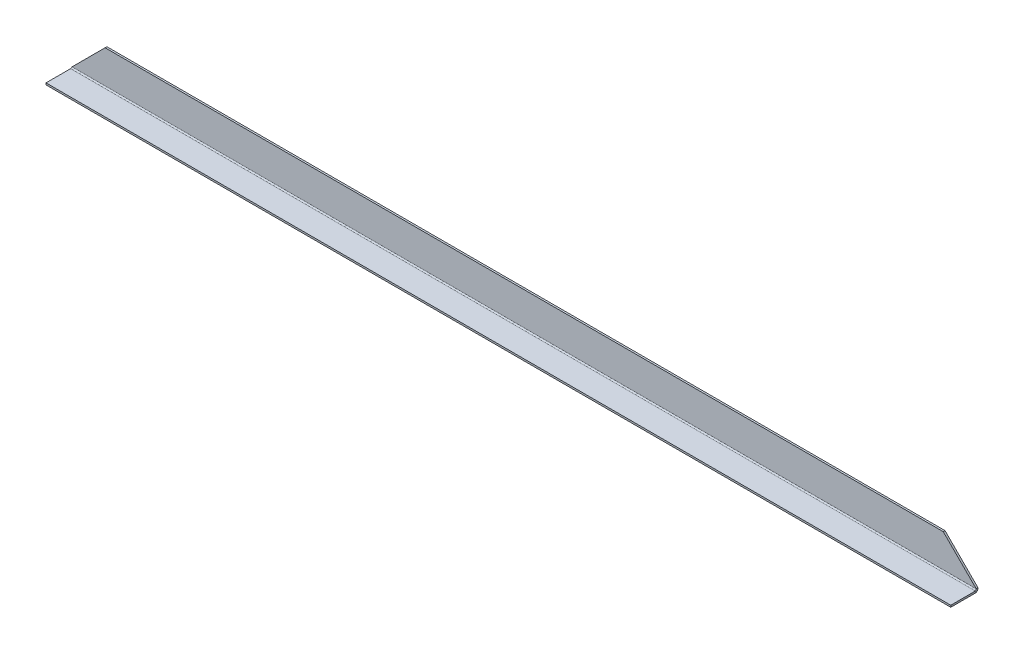
ISO-10303-21;
HEADER;
FILE_DESCRIPTION(('STEP AP214'),'2;1');
FILE_NAME('part.step','',(''),(''),'','','');
FILE_SCHEMA(('AUTOMOTIVE_DESIGN { 1 0 10303 214 1 1 1 1 }'));
ENDSEC;
DATA;
#1=APPLICATION_CONTEXT('core data for automotive mechanical design processes');
#2=APPLICATION_PROTOCOL_DEFINITION('international standard','automotive_design',2000,#1);
#3=PRODUCT_CONTEXT('',#1,'mechanical');
#4=PRODUCT('Part','Part','',(#3));
#5=PRODUCT_RELATED_PRODUCT_CATEGORY('part','',(#4));
#6=PRODUCT_DEFINITION_FORMATION('','',#4);
#7=PRODUCT_DEFINITION_CONTEXT('part definition',#1,'design');
#8=PRODUCT_DEFINITION('design','',#6,#7);
#9=PRODUCT_DEFINITION_SHAPE('','',#8);
#10=(LENGTH_UNIT() NAMED_UNIT(*) SI_UNIT(.MILLI.,.METRE.));
#11=(NAMED_UNIT(*) PLANE_ANGLE_UNIT() SI_UNIT($,.RADIAN.));
#12=(NAMED_UNIT(*) SI_UNIT($,.STERADIAN.) SOLID_ANGLE_UNIT());
#13=UNCERTAINTY_MEASURE_WITH_UNIT(LENGTH_MEASURE(1.E-05),#10,'distance_accuracy_value','');
#14=(GEOMETRIC_REPRESENTATION_CONTEXT(3) GLOBAL_UNCERTAINTY_ASSIGNED_CONTEXT((#13)) GLOBAL_UNIT_ASSIGNED_CONTEXT((#10,
#11,#12)) REPRESENTATION_CONTEXT('',''));
#15=CARTESIAN_POINT('',(0.,0.,0.));
#16=DIRECTION('',(0.,0.,1.));
#17=DIRECTION('',(1.,0.,0.));
#18=AXIS2_PLACEMENT_3D('',#15,#16,#17);
#19=CARTESIAN_POINT('',(0.,-119.000000000003,-2.92821322744885E-12));
#20=DIRECTION('',(0.,1.,0.));
#21=DIRECTION('',(0.,0.,1.));
#22=AXIS2_PLACEMENT_3D('',#19,#20,#21);
#23=PLANE('',#22);
#24=DIRECTION('',(0.,0.,1.));
#25=VECTOR('',#24,1.);
#26=CARTESIAN_POINT('',(347.792893218814,-119.,-4.02455846426619E-13));
#27=LINE('',#26,#25);
#28=CARTESIAN_POINT('',(347.792893218813,-119.,21.5));
#29=VERTEX_POINT('',#28);
#30=CARTESIAN_POINT('',(347.792893218813,-119.,0.999999999994547));
#31=VERTEX_POINT('',#30);
#32=EDGE_CURVE('E205',#29,#31,#27,.F.);
#33=ORIENTED_EDGE('',*,*,#32,.F.);
#34=DIRECTION('',(1.,0.,0.));
#35=VECTOR('',#34,1.);
#36=CARTESIAN_POINT('',(-1.43462639641393E-13,-119.000000000003,21.4999999999975));
#37=LINE('',#36,#35);
#38=CARTESIAN_POINT('',(-406.792893218813,-119.000000000005,21.4999999999945));
#39=VERTEX_POINT('',#38);
#40=EDGE_CURVE('E214',#39,#29,#37,.T.);
#41=ORIENTED_EDGE('',*,*,#40,.F.);
#42=DIRECTION('',(0.,0.,1.));
#43=VECTOR('',#42,1.);
#44=CARTESIAN_POINT('',(-406.792893218813,-119.000000000005,-5.88418203051333E-12));
#45=LINE('',#44,#43);
#46=CARTESIAN_POINT('',(-406.792893218818,-119.000000000005,0.999999999999639));
#47=VERTEX_POINT('',#46);
#48=EDGE_CURVE('E410',#47,#39,#45,.T.);
#49=ORIENTED_EDGE('',*,*,#48,.F.);
#50=DIRECTION('',(1.,0.,0.));
#51=VECTOR('',#50,1.);
#52=CARTESIAN_POINT('',(347.792893218814,-119.,1.00000000000003));
#53=LINE('',#52,#51);
#54=EDGE_CURVE('E182',#31,#47,#53,.F.);
#55=ORIENTED_EDGE('',*,*,#54,.F.);
#56=EDGE_LOOP('',(#33,#41,#49,#55));
#57=FACE_BOUND('',#56,.T.);
#58=ADVANCED_FACE('F63',(#57),#23,.F.);
#59=CARTESIAN_POINT('',(-406.792893218823,1392.22839821432,-6.10622663543836E-13));
#60=DIRECTION('',(-1.,0.,0.));
#61=DIRECTION('',(0.,1.,0.));
#62=AXIS2_PLACEMENT_3D('',#59,#60,#61);
#63=PLANE('',#62);
#64=ORIENTED_EDGE('',*,*,#48,.T.);
#65=DIRECTION('',(0.,-1.,0.));
#66=VECTOR('',#65,1.);
#67=CARTESIAN_POINT('',(-406.792893218824,1392.22839821432,21.4999999999994));
#68=LINE('',#67,#66);
#69=CARTESIAN_POINT('',(-406.792893218813,-117.500000000005,21.4999999999945));
#70=VERTEX_POINT('',#69);
#71=EDGE_CURVE('E14',#70,#39,#68,.T.);
#72=ORIENTED_EDGE('',*,*,#71,.F.);
#73=DIRECTION('',(0.,0.,1.));
#74=VECTOR('',#73,1.);
#75=CARTESIAN_POINT('',(-406.792893218813,-117.500000000005,-5.49560397189452E-12));
#76=LINE('',#75,#74);
#77=CARTESIAN_POINT('',(-406.792893218815,-117.500000000005,1.00000000000507));
#78=VERTEX_POINT('',#77);
#79=EDGE_CURVE('E414',#70,#78,#76,.F.);
#80=ORIENTED_EDGE('',*,*,#79,.T.);
#81=CARTESIAN_POINT('',(-406.792893218818,-119.000000000005,1.00000000005061));
#82=CARTESIAN_POINT('',(-406.792893218818,-117.500000000005,1.00000000002012));
#83=B_SPLINE_CURVE_WITH_KNOTS('',1,(#81,#82),.UNSPECIFIED.,.F.,.F.,(2,2),(0.,1.),.UNSPECIFIED.);
#84=EDGE_CURVE('E465',#78,#47,#83,.F.);
#85=ORIENTED_EDGE('',*,*,#84,.T.);
#86=EDGE_LOOP('',(#64,#72,#80,#85));
#87=FACE_BOUND('',#86,.T.);
#88=ADVANCED_FACE('F65',(#87),#63,.T.);
#89=CARTESIAN_POINT('',(-350.00000000001,1392.22839821432,21.4999999999998));
#90=DIRECTION('',(0.,0.,-1.));
#91=DIRECTION('',(-1.,0.,0.));
#92=AXIS2_PLACEMENT_3D('',#89,#90,#91);
#93=PLANE('',#92);
#94=ORIENTED_EDGE('',*,*,#71,.T.);
#95=ORIENTED_EDGE('',*,*,#40,.T.);
#96=DIRECTION('',(0.,-1.,0.));
#97=VECTOR('',#96,1.);
#98=CARTESIAN_POINT('',(347.792893218803,1392.22839821432,21.5000000000049));
#99=LINE('',#98,#97);
#100=CARTESIAN_POINT('',(347.792893218813,-117.500000000001,21.5));
#101=VERTEX_POINT('',#100);
#102=EDGE_CURVE('E75',#101,#29,#99,.T.);
#103=ORIENTED_EDGE('',*,*,#102,.F.);
#104=DIRECTION('',(1.,0.,0.));
#105=VECTOR('',#104,1.);
#106=CARTESIAN_POINT('',(-350.,-117.500000000005,21.4999999999949));
#107=LINE('',#106,#105);
#108=EDGE_CURVE('E86',#70,#101,#107,.T.);
#109=ORIENTED_EDGE('',*,*,#108,.F.);
#110=EDGE_LOOP('',(#94,#95,#103,#109));
#111=FACE_BOUND('',#110,.T.);
#112=ADVANCED_FACE('F435',(#111),#93,.F.);
#113=CARTESIAN_POINT('',(347.792893218803,1392.22839821432,4.87110352054287E-12));
#114=DIRECTION('',(-1.,0.,0.));
#115=DIRECTION('',(0.,1.,0.));
#116=AXIS2_PLACEMENT_3D('',#113,#114,#115);
#117=PLANE('',#116);
#118=ORIENTED_EDGE('',*,*,#102,.T.);
#119=ORIENTED_EDGE('',*,*,#32,.T.);
#120=CARTESIAN_POINT('',(347.792893218813,-117.5,0.999999999996596));
#121=CARTESIAN_POINT('',(347.792893218813,-119.,0.999999999991469));
#122=B_SPLINE_CURVE_WITH_KNOTS('',1,(#120,#121),.UNSPECIFIED.,.F.,.F.,(2,2),(0.,1.),.UNSPECIFIED.);
#123=CARTESIAN_POINT('',(347.792893218813,-117.5,0.999999999994547));
#124=VERTEX_POINT('',#123);
#125=EDGE_CURVE('E365',#124,#31,#122,.T.);
#126=ORIENTED_EDGE('',*,*,#125,.F.);
#127=DIRECTION('',(0.,0.,1.));
#128=VECTOR('',#127,1.);
#129=CARTESIAN_POINT('',(347.792893218814,-117.5,0.));
#130=LINE('',#129,#128);
#131=EDGE_CURVE('E95',#101,#124,#130,.F.);
#132=ORIENTED_EDGE('',*,*,#131,.F.);
#133=EDGE_LOOP('',(#118,#119,#126,#132));
#134=FACE_BOUND('',#133,.T.);
#135=ADVANCED_FACE('F425',(#134),#117,.F.);
#136=CARTESIAN_POINT('',(0.,-117.500000000003,-2.92821322744885E-12));
#137=DIRECTION('',(0.,1.,0.));
#138=DIRECTION('',(0.,0.,1.));
#139=AXIS2_PLACEMENT_3D('',#136,#137,#138);
#140=PLANE('',#139);
#141=ORIENTED_EDGE('',*,*,#79,.F.);
#142=ORIENTED_EDGE('',*,*,#108,.T.);
#143=ORIENTED_EDGE('',*,*,#131,.T.);
#144=DIRECTION('',(1.,0.,0.));
#145=VECTOR('',#144,1.);
#146=CARTESIAN_POINT('',(347.792893218814,-117.5,1.));
#147=LINE('',#146,#145);
#148=EDGE_CURVE('E370',#124,#78,#147,.F.);
#149=ORIENTED_EDGE('',*,*,#148,.T.);
#150=EDGE_LOOP('',(#141,#142,#143,#149));
#151=FACE_BOUND('',#150,.T.);
#152=ADVANCED_FACE('F434',(#151),#140,.T.);
#153=CARTESIAN_POINT('',(-320.,-89.0000000000001,1509.00265075977));
#154=DIRECTION('',(0.,-1.,0.));
#155=DIRECTION('',(0.,0.,-1.));
#156=AXIS2_PLACEMENT_3D('',#153,#154,#155);
#157=PLANE('',#156);
#158=DIRECTION('',(-1.,0.,0.));
#159=VECTOR('',#158,1.);
#160=CARTESIAN_POINT('',(0.,-89.0000000000001,-1.5));
#161=LINE('',#160,#159);
#162=CARTESIAN_POINT('',(-379.,-89.0000000000001,-1.5));
#163=VERTEX_POINT('',#162);
#164=CARTESIAN_POINT('',(320.,-89.0000000000001,-1.50000000000006));
#165=VERTEX_POINT('',#164);
#166=EDGE_CURVE('E342',#163,#165,#161,.F.);
#167=ORIENTED_EDGE('',*,*,#166,.F.);
#168=DIRECTION('',(0.,0.,-1.));
#169=VECTOR('',#168,1.);
#170=CARTESIAN_POINT('',(-379.,-89.0000000000001,1509.00265075977));
#171=LINE('',#170,#169);
#172=CARTESIAN_POINT('',(-379.,-89.0000000000001,0.));
#173=VERTEX_POINT('',#172);
#174=EDGE_CURVE('E201',#173,#163,#171,.T.);
#175=ORIENTED_EDGE('',*,*,#174,.F.);
#176=DIRECTION('',(1.,0.,0.));
#177=VECTOR('',#176,1.);
#178=CARTESIAN_POINT('',(-320.,-89.0000000000001,0.));
#179=LINE('',#178,#177);
#180=CARTESIAN_POINT('',(320.,-89.0000000000001,0.));
#181=VERTEX_POINT('',#180);
#182=EDGE_CURVE('E346',#181,#173,#179,.F.);
#183=ORIENTED_EDGE('',*,*,#182,.F.);
#184=DIRECTION('',(0.,0.,-1.));
#185=VECTOR('',#184,1.);
#186=CARTESIAN_POINT('',(320.,-89.0000000000001,1509.00265075977));
#187=LINE('',#186,#185);
#188=EDGE_CURVE('E169',#181,#165,#187,.T.);
#189=ORIENTED_EDGE('',*,*,#188,.T.);
#190=EDGE_LOOP('',(#167,#175,#183,#189));
#191=FACE_BOUND('',#190,.T.);
#192=ADVANCED_FACE('F309',(#191),#157,.F.);
#193=CARTESIAN_POINT('',(0.,1.,0.));
#194=DIRECTION('',(0.,0.,-1.));
#195=DIRECTION('',(-1.,0.,0.));
#196=AXIS2_PLACEMENT_3D('',#193,#194,#195);
#197=PLANE('',#196);
#198=ORIENTED_EDGE('',*,*,#182,.T.);
#199=DIRECTION('',(-0.707106781186546,-0.707106781186549,0.));
#200=VECTOR('',#199,1.);
#201=CARTESIAN_POINT('',(-174.000000000001,116.,0.));
#202=LINE('',#201,#200);
#203=CARTESIAN_POINT('',(-406.5,-116.500000000002,-2.05347891468755E-13));
#204=VERTEX_POINT('',#203);
#205=EDGE_CURVE('E349',#173,#204,#202,.T.);
#206=ORIENTED_EDGE('',*,*,#205,.T.);
#207=DIRECTION('',(-1.,0.,0.));
#208=VECTOR('',#207,1.);
#209=CARTESIAN_POINT('',(0.,-116.5,0.));
#210=LINE('',#209,#208);
#211=CARTESIAN_POINT('',(347.500000000001,-116.5,0.));
#212=VERTEX_POINT('',#211);
#213=EDGE_CURVE('E170',#212,#204,#210,.T.);
#214=ORIENTED_EDGE('',*,*,#213,.F.);
#215=DIRECTION('',(0.707106781186548,-0.707106781186547,0.));
#216=VECTOR('',#215,1.);
#217=CARTESIAN_POINT('',(115.,116.,0.));
#218=LINE('',#217,#216);
#219=EDGE_CURVE('E345',#181,#212,#218,.T.);
#220=ORIENTED_EDGE('',*,*,#219,.F.);
#221=EDGE_LOOP('',(#198,#206,#214,#220));
#222=FACE_BOUND('',#221,.T.);
#223=ADVANCED_FACE('F457',(#222),#197,.F.);
#224=CARTESIAN_POINT('',(115.,116.,1509.00265075977));
#225=DIRECTION('',(0.707106781186547,0.707106781186548,0.));
#226=DIRECTION('',(-0.707106781186548,0.707106781186547,0.));
#227=AXIS2_PLACEMENT_3D('',#224,#225,#226);
#228=PLANE('',#227);
#229=CARTESIAN_POINT('',(347.5,-116.499999999992,-1.49999999999998));
#230=CARTESIAN_POINT('',(347.5,-116.499999999997,0.));
#231=B_SPLINE_CURVE_WITH_KNOTS('',1,(#229,#230),.UNSPECIFIED.,.F.,.F.,(2,2),(0.,1.),.UNSPECIFIED.);
#232=CARTESIAN_POINT('',(347.5,-116.5,-1.49999999999999));
#233=VERTEX_POINT('',#232);
#234=EDGE_CURVE('E333',#212,#233,#231,.F.);
#235=ORIENTED_EDGE('',*,*,#234,.T.);
#236=DIRECTION('',(0.707106781186548,-0.707106781186547,0.));
#237=VECTOR('',#236,1.);
#238=CARTESIAN_POINT('',(115.,116.,-1.5));
#239=LINE('',#238,#237);
#240=EDGE_CURVE('E194',#165,#233,#239,.T.);
#241=ORIENTED_EDGE('',*,*,#240,.F.);
#242=ORIENTED_EDGE('',*,*,#188,.F.);
#243=ORIENTED_EDGE('',*,*,#219,.T.);
#244=EDGE_LOOP('',(#235,#241,#242,#243));
#245=FACE_BOUND('',#244,.T.);
#246=ADVANCED_FACE('F359',(#245),#228,.T.);
#247=CARTESIAN_POINT('',(0.,1.,-1.5));
#248=DIRECTION('',(0.,0.,-1.));
#249=DIRECTION('',(-1.,0.,0.));
#250=AXIS2_PLACEMENT_3D('',#247,#248,#249);
#251=PLANE('',#250);
#252=DIRECTION('',(-0.707106781186546,-0.707106781186549,0.));
#253=VECTOR('',#252,1.);
#254=CARTESIAN_POINT('',(-174.000000000001,116.,-1.5));
#255=LINE('',#254,#253);
#256=CARTESIAN_POINT('',(-406.5,-116.499999999997,-1.50000000000021));
#257=VERTEX_POINT('',#256);
#258=EDGE_CURVE('E191',#163,#257,#255,.T.);
#259=ORIENTED_EDGE('',*,*,#258,.F.);
#260=ORIENTED_EDGE('',*,*,#166,.T.);
#261=ORIENTED_EDGE('',*,*,#240,.T.);
#262=DIRECTION('',(-1.,0.,0.));
#263=VECTOR('',#262,1.);
#264=CARTESIAN_POINT('',(0.,-116.5,-1.5));
#265=LINE('',#264,#263);
#266=EDGE_CURVE('E180',#233,#257,#265,.T.);
#267=ORIENTED_EDGE('',*,*,#266,.T.);
#268=EDGE_LOOP('',(#259,#260,#261,#267));
#269=FACE_BOUND('',#268,.T.);
#270=ADVANCED_FACE('F190',(#269),#251,.T.);
#271=CARTESIAN_POINT('',(-174.000000000001,116.,1509.00265075977));
#272=DIRECTION('',(0.707106781186549,-0.707106781186546,0.));
#273=DIRECTION('',(0.707106781186546,0.707106781186549,0.));
#274=AXIS2_PLACEMENT_3D('',#271,#272,#273);
#275=PLANE('',#274);
#276=ORIENTED_EDGE('',*,*,#258,.T.);
#277=CARTESIAN_POINT('',(-406.5,-116.500000000002,-2.05347891468755E-13));
#278=CARTESIAN_POINT('',(-406.5,-116.499999999997,-1.50000000000021));
#279=B_SPLINE_CURVE_WITH_KNOTS('',1,(#277,#278),.UNSPECIFIED.,.F.,.F.,(2,2),(0.,1.),.UNSPECIFIED.);
#280=EDGE_CURVE('E154',#204,#257,#279,.T.);
#281=ORIENTED_EDGE('',*,*,#280,.F.);
#282=ORIENTED_EDGE('',*,*,#205,.F.);
#283=ORIENTED_EDGE('',*,*,#174,.T.);
#284=EDGE_LOOP('',(#276,#281,#282,#283));
#285=FACE_BOUND('',#284,.T.);
#286=ADVANCED_FACE('F199',(#285),#275,.F.);
#287=CARTESIAN_POINT('',(-406.792893218818,-119.000000000005,1.00000000005061));
#288=CARTESIAN_POINT('',(-406.768481074274,-119.000000000012,0.672692089556284));
#289=CARTESIAN_POINT('',(-406.744077682348,-118.934931691687,0.345630289141247));
#290=CARTESIAN_POINT('',(-406.695262145878,-118.684465970907,-0.259047450900509));
#291=CARTESIAN_POINT('',(-406.670854377644,-118.499167106017,-0.536366799916999));
#292=CARTESIAN_POINT('',(-406.622038841174,-118.036366799956,-0.999167105986062));
#293=CARTESIAN_POINT('',(-406.597631072939,-117.759047450943,-1.18446597088069));
#294=CARTESIAN_POINT('',(-406.548815536469,-117.154369710905,-1.43493169167118));
#295=CARTESIAN_POINT('',(-406.524412144544,-116.827307910491,-1.50000000000129));
#296=CARTESIAN_POINT('',(-406.5,-116.499999999997,-1.50000000000021));
#297=CARTESIAN_POINT('',(-406.792893218818,-117.500000000005,1.00000000002012));
#298=CARTESIAN_POINT('',(-406.76848119779,-117.500000000008,0.869077498242816));
#299=CARTESIAN_POINT('',(-406.744077682348,-117.473972676678,0.738252115656375));
#300=CARTESIAN_POINT('',(-406.695262145878,-117.373786388366,0.496381019639674));
#301=CARTESIAN_POINT('',(-406.670854377644,-117.29966684241,0.385453280033077));
#302=CARTESIAN_POINT('',(-406.622038841174,-117.114546719986,0.200333157605452));
#303=CARTESIAN_POINT('',(-406.597631072939,-117.00361898038,0.126213611647602));
#304=CARTESIAN_POINT('',(-406.548815536469,-116.761747884365,0.0260273233314073));
#305=CARTESIAN_POINT('',(-406.524412021028,-116.630922501779,-6.38016255236368E-13));
#306=CARTESIAN_POINT('',(-406.5,-116.500000000002,-2.05347891468755E-13));
#307=B_SPLINE_SURFACE_WITH_KNOTS('',1,3,((#287,#288,#289,#290,#291,#292,#293,#294,#295,#296),
(#297,#298,#299,#300,#301,#302,#303,#304,#305,#306)),.UNSPECIFIED.,.F.,.F.,.F.,(2,2),(4,2,2,2,
4),(0.,1.),(0.,0.25,0.5,0.75,1.),.UNSPECIFIED.);
#308=CARTESIAN_POINT('',(-406.792893218818,-117.500000000005,1.00000000002012));
#309=CARTESIAN_POINT('',(-406.76848119779,-117.500000000008,0.869077498242816));
#310=CARTESIAN_POINT('',(-406.744077682348,-117.473972676678,0.738252115656375));
#311=CARTESIAN_POINT('',(-406.695262145878,-117.373786388366,0.496381019639674));
#312=CARTESIAN_POINT('',(-406.670854377644,-117.29966684241,0.385453280033077));
#313=CARTESIAN_POINT('',(-406.622038841174,-117.114546719986,0.200333157605452));
#314=CARTESIAN_POINT('',(-406.597631072939,-117.00361898038,0.126213611647602));
#315=CARTESIAN_POINT('',(-406.548815536469,-116.761747884365,0.0260273233314073));
#316=CARTESIAN_POINT('',(-406.524412021028,-116.630922501779,-6.38016255236368E-13));
#317=CARTESIAN_POINT('',(-406.5,-116.500000000002,-2.05347891468755E-13));
#318=B_SPLINE_CURVE_WITH_KNOTS('',3,(#308,#309,#310,#311,#312,#313,#314,#315,#316,#317),
.UNSPECIFIED.,.F.,.F.,(4,2,2,2,4),(0.,0.25,0.5,0.75,1.),.UNSPECIFIED.);
#319=EDGE_CURVE('E162',#78,#204,#318,.T.);
#320=CARTESIAN_POINT('',(-406.5,-116.499999999997,-1.50000000000021));
#321=CARTESIAN_POINT('',(-406.524412144544,-116.827307910491,-1.50000000000129));
#322=CARTESIAN_POINT('',(-406.548815536469,-117.154369710905,-1.43493169167118));
#323=CARTESIAN_POINT('',(-406.597631072939,-117.759047450943,-1.18446597088069));
#324=CARTESIAN_POINT('',(-406.622038841174,-118.036366799956,-0.999167105986062));
#325=CARTESIAN_POINT('',(-406.670854377644,-118.499167106017,-0.536366799916999));
#326=CARTESIAN_POINT('',(-406.695262145878,-118.684465970907,-0.259047450900509));
#327=CARTESIAN_POINT('',(-406.744077682348,-118.934931691687,0.345630289141247));
#328=CARTESIAN_POINT('',(-406.768481074274,-119.000000000012,0.672692089556284));
#329=CARTESIAN_POINT('',(-406.792893218818,-119.000000000005,1.00000000005061));
#330=B_SPLINE_CURVE_WITH_KNOTS('',3,(#320,#321,#322,#323,#324,#325,#326,#327,#328,#329),
.UNSPECIFIED.,.F.,.F.,(4,2,2,2,4),(0.,0.25,0.5,0.75,1.),.UNSPECIFIED.);
#331=EDGE_CURVE('E159',#47,#257,#330,.F.);
#332=ORIENTED_EDGE('',*,*,#84,.F.);
#333=ORIENTED_EDGE('',*,*,#319,.T.);
#334=ORIENTED_EDGE('',*,*,#280,.T.);
#335=ORIENTED_EDGE('',*,*,#331,.F.);
#336=EDGE_LOOP('',(#332,#333,#334,#335));
#337=FACE_BOUND('',#336,.T.);
#338=ADVANCED_FACE('F158',(#337),#307,.T.);
#339=CARTESIAN_POINT('',(347.5,-116.499999999992,-1.49999999999998));
#340=CARTESIAN_POINT('',(347.524412144544,-116.827307910481,-1.50000000000107));
#341=CARTESIAN_POINT('',(347.548815536469,-117.154369710891,-1.43493169167295));
#342=CARTESIAN_POINT('',(347.597631072938,-117.75904745092,-1.18446597088984));
#343=CARTESIAN_POINT('',(347.622038841172,-118.036366799931,-0.999167106000584));
#344=CARTESIAN_POINT('',(347.670854377641,-118.499167105991,-0.53636679994401));
#345=CARTESIAN_POINT('',(347.695262145876,-118.684465970882,-0.259047450934617));
#346=CARTESIAN_POINT('',(347.744077682345,-118.934931691669,0.345630289093538));
#347=CARTESIAN_POINT('',(347.76848107427,-118.999999999999,0.672692089502084));
#348=CARTESIAN_POINT('',(347.792893218813,-119.,0.999999999991469));
#349=CARTESIAN_POINT('',(347.5,-116.499999999997,0.));
#350=CARTESIAN_POINT('',(347.524412021028,-116.630922501772,-4.16359187597134E-13));
#351=CARTESIAN_POINT('',(347.548815536469,-116.761747884356,0.0260273233308325));
#352=CARTESIAN_POINT('',(347.597631072938,-117.003618980368,0.126213611644077));
#353=CARTESIAN_POINT('',(347.622038841172,-117.114546719973,0.200333157599778));
#354=CARTESIAN_POINT('',(347.670854377641,-117.299666842397,0.385453280022407));
#355=CARTESIAN_POINT('',(347.695262145876,-117.373786388353,0.496381019626162));
#356=CARTESIAN_POINT('',(347.744077682345,-117.473972676668,0.738252115637424));
#357=CARTESIAN_POINT('',(347.768481197786,-117.5,0.869077498221292));
#358=CARTESIAN_POINT('',(347.792893218813,-117.5,0.999999999996596));
#359=B_SPLINE_SURFACE_WITH_KNOTS('',1,3,((#339,#340,#341,#342,#343,#344,#345,#346,#347,#348),
(#349,#350,#351,#352,#353,#354,#355,#356,#357,#358)),.UNSPECIFIED.,.F.,.F.,.F.,(2,2),(4,2,2,2,
4),(0.,1.),(0.,0.25,0.5,0.75,1.),.UNSPECIFIED.);
#360=CARTESIAN_POINT('',(347.5,-116.499999999997,0.));
#361=CARTESIAN_POINT('',(347.524412021028,-116.630922501772,-4.16359187597134E-13));
#362=CARTESIAN_POINT('',(347.548815536469,-116.761747884356,0.0260273233308325));
#363=CARTESIAN_POINT('',(347.597631072938,-117.003618980368,0.126213611644077));
#364=CARTESIAN_POINT('',(347.622038841172,-117.114546719973,0.200333157599778));
#365=CARTESIAN_POINT('',(347.670854377641,-117.299666842397,0.385453280022407));
#366=CARTESIAN_POINT('',(347.695262145876,-117.373786388353,0.496381019626162));
#367=CARTESIAN_POINT('',(347.744077682345,-117.473972676668,0.738252115637424));
#368=CARTESIAN_POINT('',(347.768481197786,-117.5,0.869077498221292));
#369=CARTESIAN_POINT('',(347.792893218813,-117.5,0.999999999996596));
#370=B_SPLINE_CURVE_WITH_KNOTS('',3,(#360,#361,#362,#363,#364,#365,#366,#367,#368,#369),
.UNSPECIFIED.,.F.,.F.,(4,2,2,2,4),(0.,0.25,0.5,0.75,1.),.UNSPECIFIED.);
#371=EDGE_CURVE('E185',#212,#124,#370,.T.);
#372=CARTESIAN_POINT('',(347.792893218813,-119.,0.999999999991469));
#373=CARTESIAN_POINT('',(347.76848107427,-118.999999999999,0.672692089502084));
#374=CARTESIAN_POINT('',(347.744077682345,-118.934931691669,0.345630289093538));
#375=CARTESIAN_POINT('',(347.695262145876,-118.684465970882,-0.259047450934617));
#376=CARTESIAN_POINT('',(347.670854377641,-118.499167105991,-0.53636679994401));
#377=CARTESIAN_POINT('',(347.622038841172,-118.036366799931,-0.999167106000584));
#378=CARTESIAN_POINT('',(347.597631072938,-117.75904745092,-1.18446597088984));
#379=CARTESIAN_POINT('',(347.548815536469,-117.154369710891,-1.43493169167295));
#380=CARTESIAN_POINT('',(347.524412144544,-116.827307910481,-1.50000000000107));
#381=CARTESIAN_POINT('',(347.5,-116.499999999992,-1.49999999999998));
#382=B_SPLINE_CURVE_WITH_KNOTS('',3,(#372,#373,#374,#375,#376,#377,#378,#379,#380,#381),
.UNSPECIFIED.,.F.,.F.,(4,2,2,2,4),(0.,0.25,0.5,0.75,1.),.UNSPECIFIED.);
#383=EDGE_CURVE('E184',#233,#31,#382,.F.);
#384=ORIENTED_EDGE('',*,*,#371,.T.);
#385=ORIENTED_EDGE('',*,*,#125,.T.);
#386=ORIENTED_EDGE('',*,*,#383,.F.);
#387=ORIENTED_EDGE('',*,*,#234,.F.);
#388=EDGE_LOOP('',(#384,#385,#386,#387));
#389=FACE_BOUND('',#388,.T.);
#390=ADVANCED_FACE('F260',(#389),#359,.T.);
#391=CARTESIAN_POINT('',(-1162.92166707726,-116.50000000001,0.999999999999569));
#392=DIRECTION('',(1.,0.,0.));
#393=DIRECTION('',(0.,1.,0.));
#394=AXIS2_PLACEMENT_3D('',#391,#392,#393);
#395=CYLINDRICAL_SURFACE('',#394,2.5);
#396=ORIENTED_EDGE('',*,*,#266,.F.);
#397=ORIENTED_EDGE('',*,*,#383,.T.);
#398=ORIENTED_EDGE('',*,*,#54,.T.);
#399=ORIENTED_EDGE('',*,*,#331,.T.);
#400=EDGE_LOOP('',(#396,#397,#398,#399));
#401=FACE_BOUND('',#400,.T.);
#402=ADVANCED_FACE('F178',(#401),#395,.T.);
#403=CARTESIAN_POINT('',(-1162.92166707726,-116.50000000001,0.999999999999569));
#404=DIRECTION('',(1.,0.,0.));
#405=DIRECTION('',(0.,1.,0.));
#406=AXIS2_PLACEMENT_3D('',#403,#404,#405);
#407=CYLINDRICAL_SURFACE('',#406,0.999999999999997);
#408=ORIENTED_EDGE('',*,*,#213,.T.);
#409=ORIENTED_EDGE('',*,*,#319,.F.);
#410=ORIENTED_EDGE('',*,*,#148,.F.);
#411=ORIENTED_EDGE('',*,*,#371,.F.);
#412=EDGE_LOOP('',(#408,#409,#410,#411));
#413=FACE_BOUND('',#412,.T.);
#414=ADVANCED_FACE('F259',(#413),#407,.F.);
#415=CLOSED_SHELL('',(#58,#88,#112,#135,#152,#192,#223,#246,#270,#286,#338,#390,#402,#414));
#416=MANIFOLD_SOLID_BREP('B2',#415);
#417=ADVANCED_BREP_SHAPE_REPRESENTATION('',(#18,#416),#14);
#418=SHAPE_DEFINITION_REPRESENTATION(#9,#417);
ENDSEC;
END-ISO-10303-21;
